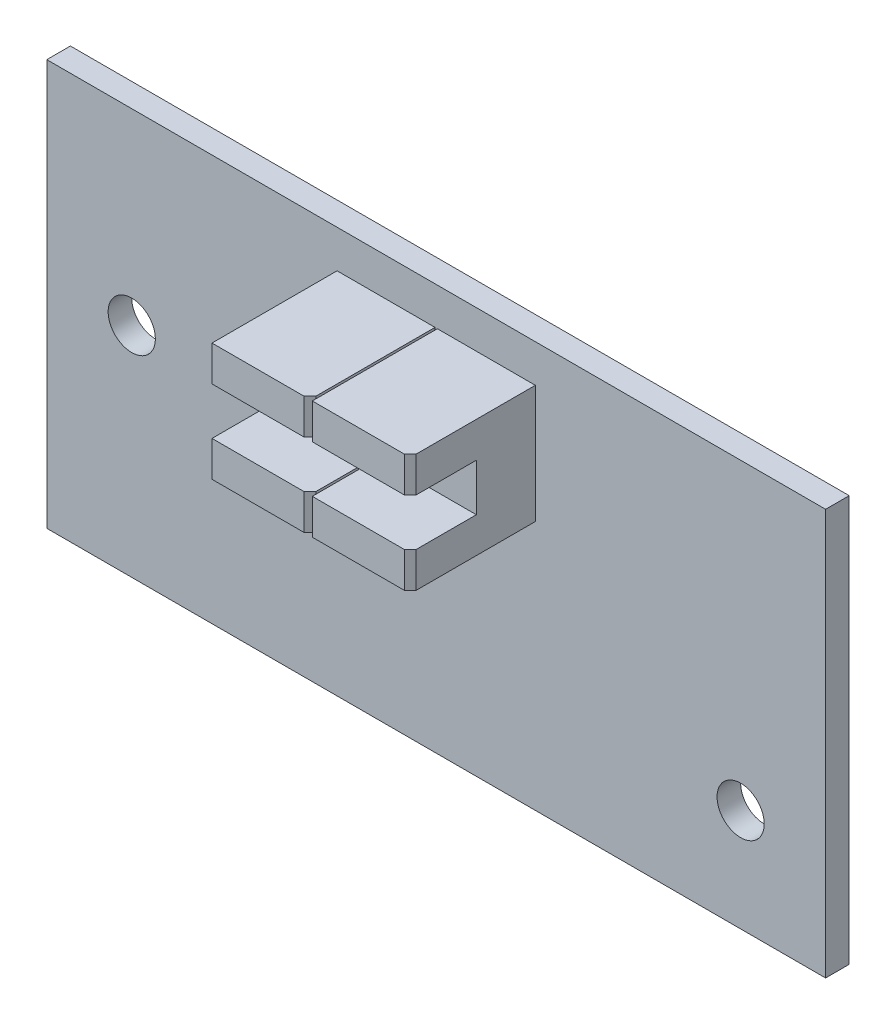
ISO-10303-21;
HEADER;
FILE_DESCRIPTION(('STEP AP214'),'2;1');
FILE_NAME('part.step','',(''),(''),'','','');
FILE_SCHEMA(('AUTOMOTIVE_DESIGN { 1 0 10303 214 1 1 1 1 }'));
ENDSEC;
DATA;
#1=APPLICATION_CONTEXT('core data for automotive mechanical design processes');
#2=APPLICATION_PROTOCOL_DEFINITION('international standard','automotive_design',2000,#1);
#3=PRODUCT_CONTEXT('',#1,'mechanical');
#4=PRODUCT('Part','Part','',(#3));
#5=PRODUCT_RELATED_PRODUCT_CATEGORY('part','',(#4));
#6=PRODUCT_DEFINITION_FORMATION('','',#4);
#7=PRODUCT_DEFINITION_CONTEXT('part definition',#1,'design');
#8=PRODUCT_DEFINITION('design','',#6,#7);
#9=PRODUCT_DEFINITION_SHAPE('','',#8);
#10=(LENGTH_UNIT() NAMED_UNIT(*) SI_UNIT(.MILLI.,.METRE.));
#11=(NAMED_UNIT(*) PLANE_ANGLE_UNIT() SI_UNIT($,.RADIAN.));
#12=(NAMED_UNIT(*) SI_UNIT($,.STERADIAN.) SOLID_ANGLE_UNIT());
#13=UNCERTAINTY_MEASURE_WITH_UNIT(LENGTH_MEASURE(1.E-05),#10,'distance_accuracy_value','');
#14=(GEOMETRIC_REPRESENTATION_CONTEXT(3) GLOBAL_UNCERTAINTY_ASSIGNED_CONTEXT((#13)) GLOBAL_UNIT_ASSIGNED_CONTEXT((#10,
#11,#12)) REPRESENTATION_CONTEXT('',''));
#15=CARTESIAN_POINT('',(0.,0.,0.));
#16=DIRECTION('',(0.,0.,1.));
#17=DIRECTION('',(1.,0.,0.));
#18=AXIS2_PLACEMENT_3D('',#15,#16,#17);
#19=CARTESIAN_POINT('',(-4.2,7.,3.5));
#20=DIRECTION('',(0.,1.,0.));
#21=DIRECTION('',(-1.,0.,0.));
#22=AXIS2_PLACEMENT_3D('',#19,#20,#21);
#23=PLANE('',#22);
#24=DIRECTION('',(1.,0.,0.));
#25=VECTOR('',#24,1.);
#26=CARTESIAN_POINT('',(0.,7.,6.3));
#27=LINE('',#26,#25);
#28=CARTESIAN_POINT('',(0.0499999999999997,7.,6.3));
#29=VERTEX_POINT('',#28);
#30=CARTESIAN_POINT('',(3.95000000000001,7.,6.3));
#31=VERTEX_POINT('',#30);
#32=EDGE_CURVE('E420',#29,#31,#27,.T.);
#33=ORIENTED_EDGE('',*,*,#32,.T.);
#34=DIRECTION('',(-0.707106781186543,0.,0.707106781186552));
#35=VECTOR('',#34,1.);
#36=CARTESIAN_POINT('',(1.27500000000005,7.,8.97499999999999));
#37=LINE('',#36,#35);
#38=CARTESIAN_POINT('',(4.2,7.,6.05));
#39=VERTEX_POINT('',#38);
#40=EDGE_CURVE('E310',#31,#39,#37,.F.);
#41=ORIENTED_EDGE('',*,*,#40,.T.);
#42=DIRECTION('',(0.,0.,-1.));
#43=VECTOR('',#42,1.);
#44=CARTESIAN_POINT('',(4.2,7.,3.5));
#45=LINE('',#44,#43);
#46=CARTESIAN_POINT('',(4.2,7.,1.));
#47=VERTEX_POINT('',#46);
#48=EDGE_CURVE('E240',#39,#47,#45,.T.);
#49=ORIENTED_EDGE('',*,*,#48,.T.);
#50=DIRECTION('',(1.,0.,0.));
#51=VECTOR('',#50,1.);
#52=CARTESIAN_POINT('',(-4.2,7.,1.));
#53=LINE('',#52,#51);
#54=CARTESIAN_POINT('',(0.0499999999999997,7.,1.));
#55=VERTEX_POINT('',#54);
#56=EDGE_CURVE('E366',#55,#47,#53,.T.);
#57=ORIENTED_EDGE('',*,*,#56,.F.);
#58=DIRECTION('',(0.,0.,1.));
#59=VECTOR('',#58,1.);
#60=CARTESIAN_POINT('',(0.0499999999999997,7.,-4.00099990001999));
#61=LINE('',#60,#59);
#62=EDGE_CURVE('E201',#55,#29,#61,.T.);
#63=ORIENTED_EDGE('',*,*,#62,.T.);
#64=EDGE_LOOP('',(#33,#41,#49,#57,#63));
#65=FACE_BOUND('',#64,.T.);
#66=ADVANCED_FACE('F36',(#65),#23,.T.);
#67=CARTESIAN_POINT('',(-4.2,2.,3.5));
#68=DIRECTION('',(0.,1.,0.));
#69=DIRECTION('',(0.,0.,1.));
#70=AXIS2_PLACEMENT_3D('',#67,#68,#69);
#71=PLANE('',#70);
#72=DIRECTION('',(0.,0.,-1.));
#73=VECTOR('',#72,1.);
#74=CARTESIAN_POINT('',(4.2,2.,3.5));
#75=LINE('',#74,#73);
#76=CARTESIAN_POINT('',(4.2,2.,6.05));
#77=VERTEX_POINT('',#76);
#78=CARTESIAN_POINT('',(4.2,2.,1.));
#79=VERTEX_POINT('',#78);
#80=EDGE_CURVE('E238',#77,#79,#75,.T.);
#81=ORIENTED_EDGE('',*,*,#80,.F.);
#82=DIRECTION('',(0.707106781186543,0.,-0.707106781186552));
#83=VECTOR('',#82,1.);
#84=CARTESIAN_POINT('',(4.2,2.,6.05));
#85=LINE('',#84,#83);
#86=CARTESIAN_POINT('',(3.95000000000001,2.,6.3));
#87=VERTEX_POINT('',#86);
#88=EDGE_CURVE('E300',#77,#87,#85,.F.);
#89=ORIENTED_EDGE('',*,*,#88,.T.);
#90=DIRECTION('',(1.,0.,0.));
#91=VECTOR('',#90,1.);
#92=CARTESIAN_POINT('',(0.,2.,6.3));
#93=LINE('',#92,#91);
#94=CARTESIAN_POINT('',(0.0500000000000006,2.,6.3));
#95=VERTEX_POINT('',#94);
#96=EDGE_CURVE('E215',#95,#87,#93,.T.);
#97=ORIENTED_EDGE('',*,*,#96,.F.);
#98=DIRECTION('',(0.,0.,1.));
#99=VECTOR('',#98,1.);
#100=CARTESIAN_POINT('',(0.0500000000000006,2.,-4.00099990001999));
#101=LINE('',#100,#99);
#102=CARTESIAN_POINT('',(0.0500000000000006,2.,1.));
#103=VERTEX_POINT('',#102);
#104=EDGE_CURVE('E198',#103,#95,#101,.T.);
#105=ORIENTED_EDGE('',*,*,#104,.F.);
#106=DIRECTION('',(1.,0.,0.));
#107=VECTOR('',#106,1.);
#108=CARTESIAN_POINT('',(-4.2,2.,1.));
#109=LINE('',#108,#107);
#110=EDGE_CURVE('E212',#103,#79,#109,.T.);
#111=ORIENTED_EDGE('',*,*,#110,.T.);
#112=EDGE_LOOP('',(#81,#89,#97,#105,#111));
#113=FACE_BOUND('',#112,.T.);
#114=ADVANCED_FACE('F211',(#113),#71,.F.);
#115=CARTESIAN_POINT('',(0.,0.,3.5));
#116=DIRECTION('',(0.,0.,-1.));
#117=DIRECTION('',(-1.,0.,0.));
#118=AXIS2_PLACEMENT_3D('',#115,#116,#117);
#119=PLANE('',#118);
#120=DIRECTION('',(-1.,0.,0.));
#121=VECTOR('',#120,1.);
#122=CARTESIAN_POINT('',(0.,5.5,3.5));
#123=LINE('',#122,#121);
#124=CARTESIAN_POINT('',(4.2,5.5,3.5));
#125=VERTEX_POINT('',#124);
#126=CARTESIAN_POINT('',(0.05,5.5,3.5));
#127=VERTEX_POINT('',#126);
#128=EDGE_CURVE('E289',#125,#127,#123,.T.);
#129=ORIENTED_EDGE('',*,*,#128,.T.);
#130=DIRECTION('',(0.,-1.,0.));
#131=VECTOR('',#130,1.);
#132=CARTESIAN_POINT('',(0.0500000000000009,0.,3.5));
#133=LINE('',#132,#131);
#134=CARTESIAN_POINT('',(0.0500000000000003,3.5,3.5));
#135=VERTEX_POINT('',#134);
#136=EDGE_CURVE('E408',#127,#135,#133,.T.);
#137=ORIENTED_EDGE('',*,*,#136,.T.);
#138=DIRECTION('',(1.,0.,0.));
#139=VECTOR('',#138,1.);
#140=CARTESIAN_POINT('',(0.,3.5,3.5));
#141=LINE('',#140,#139);
#142=CARTESIAN_POINT('',(4.2,3.5,3.5));
#143=VERTEX_POINT('',#142);
#144=EDGE_CURVE('E284',#135,#143,#141,.T.);
#145=ORIENTED_EDGE('',*,*,#144,.T.);
#146=DIRECTION('',(0.,-1.,0.));
#147=VECTOR('',#146,1.);
#148=CARTESIAN_POINT('',(4.2,7.,3.5));
#149=LINE('',#148,#147);
#150=EDGE_CURVE('E231',#125,#143,#149,.T.);
#151=ORIENTED_EDGE('',*,*,#150,.F.);
#152=EDGE_LOOP('',(#129,#137,#145,#151));
#153=FACE_BOUND('',#152,.T.);
#154=ADVANCED_FACE('F399',(#153),#119,.F.);
#155=CARTESIAN_POINT('',(0.,3.5,6.3));
#156=DIRECTION('',(0.,1.,0.));
#157=DIRECTION('',(0.,0.,1.));
#158=AXIS2_PLACEMENT_3D('',#155,#156,#157);
#159=PLANE('',#158);
#160=DIRECTION('',(1.,0.,0.));
#161=VECTOR('',#160,1.);
#162=CARTESIAN_POINT('',(0.,3.5,6.3));
#163=LINE('',#162,#161);
#164=CARTESIAN_POINT('',(0.0500000000000003,3.5,6.3));
#165=VERTEX_POINT('',#164);
#166=CARTESIAN_POINT('',(3.95000000000001,3.5,6.3));
#167=VERTEX_POINT('',#166);
#168=EDGE_CURVE('E393',#165,#167,#163,.T.);
#169=ORIENTED_EDGE('',*,*,#168,.T.);
#170=DIRECTION('',(-0.707106781186543,0.,0.707106781186552));
#171=VECTOR('',#170,1.);
#172=CARTESIAN_POINT('',(1.97500000000003,3.5,8.275));
#173=LINE('',#172,#171);
#174=CARTESIAN_POINT('',(4.2,3.5,6.05));
#175=VERTEX_POINT('',#174);
#176=EDGE_CURVE('E304',#167,#175,#173,.F.);
#177=ORIENTED_EDGE('',*,*,#176,.T.);
#178=DIRECTION('',(0.,0.,-1.));
#179=VECTOR('',#178,1.);
#180=CARTESIAN_POINT('',(4.2,3.5,6.3));
#181=LINE('',#180,#179);
#182=EDGE_CURVE('E357',#175,#143,#181,.T.);
#183=ORIENTED_EDGE('',*,*,#182,.T.);
#184=ORIENTED_EDGE('',*,*,#144,.F.);
#185=DIRECTION('',(0.,0.,-1.));
#186=VECTOR('',#185,1.);
#187=CARTESIAN_POINT('',(0.0500000000000003,3.5,6.3));
#188=LINE('',#187,#186);
#189=EDGE_CURVE('E410',#165,#135,#188,.T.);
#190=ORIENTED_EDGE('',*,*,#189,.F.);
#191=EDGE_LOOP('',(#169,#177,#183,#184,#190));
#192=FACE_BOUND('',#191,.T.);
#193=ADVANCED_FACE('F389',(#192),#159,.T.);
#194=CARTESIAN_POINT('',(0.,0.,6.3));
#195=DIRECTION('',(0.,0.,1.));
#196=DIRECTION('',(1.,0.,0.));
#197=AXIS2_PLACEMENT_3D('',#194,#195,#196);
#198=PLANE('',#197);
#199=ORIENTED_EDGE('',*,*,#96,.T.);
#200=DIRECTION('',(0.,1.,0.));
#201=VECTOR('',#200,1.);
#202=CARTESIAN_POINT('',(3.95000000000001,0.,6.3));
#203=LINE('',#202,#201);
#204=EDGE_CURVE('E302',#87,#167,#203,.T.);
#205=ORIENTED_EDGE('',*,*,#204,.T.);
#206=ORIENTED_EDGE('',*,*,#168,.F.);
#207=DIRECTION('',(0.,1.,0.));
#208=VECTOR('',#207,1.);
#209=CARTESIAN_POINT('',(0.0499999999999997,7.,6.3));
#210=LINE('',#209,#208);
#211=EDGE_CURVE('E216',#95,#165,#210,.T.);
#212=ORIENTED_EDGE('',*,*,#211,.F.);
#213=EDGE_LOOP('',(#199,#205,#206,#212));
#214=FACE_BOUND('',#213,.T.);
#215=ADVANCED_FACE('F383',(#214),#198,.T.);
#216=CARTESIAN_POINT('',(0.,5.5,6.3));
#217=DIRECTION('',(0.,-1.,0.));
#218=DIRECTION('',(1.,0.,0.));
#219=AXIS2_PLACEMENT_3D('',#216,#217,#218);
#220=PLANE('',#219);
#221=DIRECTION('',(0.,0.,-1.));
#222=VECTOR('',#221,1.);
#223=CARTESIAN_POINT('',(4.2,5.5,6.3));
#224=LINE('',#223,#222);
#225=CARTESIAN_POINT('',(4.2,5.5,6.05));
#226=VERTEX_POINT('',#225);
#227=EDGE_CURVE('E396',#226,#125,#224,.T.);
#228=ORIENTED_EDGE('',*,*,#227,.F.);
#229=DIRECTION('',(0.707106781186543,0.,-0.707106781186552));
#230=VECTOR('',#229,1.);
#231=CARTESIAN_POINT('',(1.97500000000003,5.5,8.275));
#232=LINE('',#231,#230);
#233=CARTESIAN_POINT('',(3.95000000000001,5.5,6.3));
#234=VERTEX_POINT('',#233);
#235=EDGE_CURVE('E306',#226,#234,#232,.F.);
#236=ORIENTED_EDGE('',*,*,#235,.T.);
#237=DIRECTION('',(-1.,0.,0.));
#238=VECTOR('',#237,1.);
#239=CARTESIAN_POINT('',(0.,5.5,6.3));
#240=LINE('',#239,#238);
#241=CARTESIAN_POINT('',(0.05,5.5,6.3));
#242=VERTEX_POINT('',#241);
#243=EDGE_CURVE('E406',#234,#242,#240,.T.);
#244=ORIENTED_EDGE('',*,*,#243,.T.);
#245=DIRECTION('',(0.,0.,1.));
#246=VECTOR('',#245,1.);
#247=CARTESIAN_POINT('',(0.05,5.5,6.3));
#248=LINE('',#247,#246);
#249=EDGE_CURVE('E343',#127,#242,#248,.T.);
#250=ORIENTED_EDGE('',*,*,#249,.F.);
#251=ORIENTED_EDGE('',*,*,#128,.F.);
#252=EDGE_LOOP('',(#228,#236,#244,#250,#251));
#253=FACE_BOUND('',#252,.T.);
#254=ADVANCED_FACE('F403',(#253),#220,.T.);
#255=CARTESIAN_POINT('',(0.,0.,6.3));
#256=DIRECTION('',(0.,0.,1.));
#257=DIRECTION('',(1.,0.,0.));
#258=AXIS2_PLACEMENT_3D('',#255,#256,#257);
#259=PLANE('',#258);
#260=ORIENTED_EDGE('',*,*,#243,.F.);
#261=DIRECTION('',(0.,1.,0.));
#262=VECTOR('',#261,1.);
#263=CARTESIAN_POINT('',(3.95000000000001,0.,6.3));
#264=LINE('',#263,#262);
#265=EDGE_CURVE('E308',#234,#31,#264,.T.);
#266=ORIENTED_EDGE('',*,*,#265,.T.);
#267=ORIENTED_EDGE('',*,*,#32,.F.);
#268=DIRECTION('',(0.,1.,0.));
#269=VECTOR('',#268,1.);
#270=CARTESIAN_POINT('',(0.0500000000000009,0.,6.3));
#271=LINE('',#270,#269);
#272=EDGE_CURVE('E292',#242,#29,#271,.T.);
#273=ORIENTED_EDGE('',*,*,#272,.F.);
#274=EDGE_LOOP('',(#260,#266,#267,#273));
#275=FACE_BOUND('',#274,.T.);
#276=ADVANCED_FACE('F455',(#275),#259,.T.);
#277=CARTESIAN_POINT('',(0.,0.,1.));
#278=DIRECTION('',(0.,0.,-1.));
#279=DIRECTION('',(-1.,0.,0.));
#280=AXIS2_PLACEMENT_3D('',#277,#278,#279);
#281=PLANE('',#280);
#282=CARTESIAN_POINT('',(-4.2,7.,1.));
#283=VERTEX_POINT('',#282);
#284=CARTESIAN_POINT('',(-0.0499999999999997,7.,1.));
#285=VERTEX_POINT('',#284);
#286=EDGE_CURVE('E226',#283,#285,#53,.T.);
#287=ORIENTED_EDGE('',*,*,#286,.T.);
#288=DIRECTION('',(0.,-1.,0.));
#289=VECTOR('',#288,1.);
#290=CARTESIAN_POINT('',(-0.0499999999999997,7.,1.));
#291=LINE('',#290,#289);
#292=CARTESIAN_POINT('',(-0.0500000000000006,2.,1.));
#293=VERTEX_POINT('',#292);
#294=EDGE_CURVE('E436',#285,#293,#291,.T.);
#295=ORIENTED_EDGE('',*,*,#294,.T.);
#296=CARTESIAN_POINT('',(-4.2,2.,1.));
#297=VERTEX_POINT('',#296);
#298=EDGE_CURVE('E222',#297,#293,#109,.T.);
#299=ORIENTED_EDGE('',*,*,#298,.F.);
#300=DIRECTION('',(0.,-1.,0.));
#301=VECTOR('',#300,1.);
#302=CARTESIAN_POINT('',(-4.2,7.,1.));
#303=LINE('',#302,#301);
#304=EDGE_CURVE('E225',#283,#297,#303,.T.);
#305=ORIENTED_EDGE('',*,*,#304,.F.);
#306=EDGE_LOOP('',(#287,#295,#299,#305));
#307=FACE_BOUND('',#306,.T.);
#308=DIRECTION('',(0.,1.,0.));
#309=VECTOR('',#308,1.);
#310=CARTESIAN_POINT('',(0.0499999999999997,7.,1.));
#311=LINE('',#310,#309);
#312=EDGE_CURVE('E195',#103,#55,#311,.T.);
#313=ORIENTED_EDGE('',*,*,#312,.T.);
#314=ORIENTED_EDGE('',*,*,#56,.T.);
#315=DIRECTION('',(0.,-1.,0.));
#316=VECTOR('',#315,1.);
#317=CARTESIAN_POINT('',(4.2,7.,1.));
#318=LINE('',#317,#316);
#319=EDGE_CURVE('E221',#47,#79,#318,.T.);
#320=ORIENTED_EDGE('',*,*,#319,.T.);
#321=ORIENTED_EDGE('',*,*,#110,.F.);
#322=EDGE_LOOP('',(#313,#314,#320,#321));
#323=FACE_BOUND('',#322,.T.);
#324=DIRECTION('',(0.,1.,0.));
#325=VECTOR('',#324,1.);
#326=CARTESIAN_POINT('',(16.5,-8.6,1.));
#327=LINE('',#326,#325);
#328=CARTESIAN_POINT('',(16.5,-8.6,1.));
#329=VERTEX_POINT('',#328);
#330=CARTESIAN_POINT('',(16.5,8.6,1.));
#331=VERTEX_POINT('',#330);
#332=EDGE_CURVE('E255',#329,#331,#327,.T.);
#333=ORIENTED_EDGE('',*,*,#332,.T.);
#334=DIRECTION('',(-1.,0.,0.));
#335=VECTOR('',#334,1.);
#336=CARTESIAN_POINT('',(-16.5,8.6,1.));
#337=LINE('',#336,#335);
#338=CARTESIAN_POINT('',(-16.5,8.6,1.));
#339=VERTEX_POINT('',#338);
#340=EDGE_CURVE('E258',#331,#339,#337,.T.);
#341=ORIENTED_EDGE('',*,*,#340,.T.);
#342=DIRECTION('',(0.,-1.,0.));
#343=VECTOR('',#342,1.);
#344=CARTESIAN_POINT('',(-16.5,-8.6,1.));
#345=LINE('',#344,#343);
#346=CARTESIAN_POINT('',(-16.5,-8.6,1.));
#347=VERTEX_POINT('',#346);
#348=EDGE_CURVE('E261',#339,#347,#345,.T.);
#349=ORIENTED_EDGE('',*,*,#348,.T.);
#350=DIRECTION('',(1.,0.,0.));
#351=VECTOR('',#350,1.);
#352=CARTESIAN_POINT('',(-16.5,-8.6,1.));
#353=LINE('',#352,#351);
#354=EDGE_CURVE('E263',#347,#329,#353,.T.);
#355=ORIENTED_EDGE('',*,*,#354,.T.);
#356=EDGE_LOOP('',(#333,#341,#349,#355));
#357=FACE_BOUND('',#356,.T.);
#358=CARTESIAN_POINT('',(-12.9,0.649999999999996,1.));
#359=DIRECTION('',(0.,0.,1.));
#360=DIRECTION('',(1.,0.,0.));
#361=AXIS2_PLACEMENT_3D('',#358,#359,#360);
#362=CIRCLE('',#361,1.);
#363=CARTESIAN_POINT('',(-11.9,0.649999999999996,1.));
#364=VERTEX_POINT('',#363);
#365=EDGE_CURVE('E249',#364,#364,#362,.T.);
#366=ORIENTED_EDGE('',*,*,#365,.F.);
#367=EDGE_LOOP('',(#366));
#368=FACE_BOUND('',#367,.T.);
#369=CARTESIAN_POINT('',(12.9,-4.25,1.));
#370=DIRECTION('',(0.,0.,1.));
#371=DIRECTION('',(1.,0.,0.));
#372=AXIS2_PLACEMENT_3D('',#369,#370,#371);
#373=CIRCLE('',#372,1.);
#374=CARTESIAN_POINT('',(13.9,-4.25,1.));
#375=VERTEX_POINT('',#374);
#376=EDGE_CURVE('E243',#375,#375,#373,.T.);
#377=ORIENTED_EDGE('',*,*,#376,.F.);
#378=EDGE_LOOP('',(#377));
#379=FACE_BOUND('',#378,.T.);
#380=ADVANCED_FACE('F218',(#307,#323,#357,#368,#379),#281,.F.);
#381=CARTESIAN_POINT('',(0.,0.,0.));
#382=DIRECTION('',(0.,0.,-1.));
#383=DIRECTION('',(-1.,0.,0.));
#384=AXIS2_PLACEMENT_3D('',#381,#382,#383);
#385=PLANE('',#384);
#386=CARTESIAN_POINT('',(-12.9,0.649999999999996,0.));
#387=DIRECTION('',(0.,0.,1.));
#388=DIRECTION('',(1.,0.,0.));
#389=AXIS2_PLACEMENT_3D('',#386,#387,#388);
#390=CIRCLE('',#389,1.);
#391=CARTESIAN_POINT('',(-11.9,0.649999999999996,0.));
#392=VERTEX_POINT('',#391);
#393=EDGE_CURVE('E246',#392,#392,#390,.T.);
#394=ORIENTED_EDGE('',*,*,#393,.T.);
#395=EDGE_LOOP('',(#394));
#396=FACE_BOUND('',#395,.T.);
#397=DIRECTION('',(0.,1.,0.));
#398=VECTOR('',#397,1.);
#399=CARTESIAN_POINT('',(16.5,-8.6,0.));
#400=LINE('',#399,#398);
#401=CARTESIAN_POINT('',(16.5,-8.6,0.));
#402=VERTEX_POINT('',#401);
#403=CARTESIAN_POINT('',(16.5,8.6,0.));
#404=VERTEX_POINT('',#403);
#405=EDGE_CURVE('E252',#402,#404,#400,.T.);
#406=ORIENTED_EDGE('',*,*,#405,.F.);
#407=DIRECTION('',(1.,0.,0.));
#408=VECTOR('',#407,1.);
#409=CARTESIAN_POINT('',(-16.5,-8.6,0.));
#410=LINE('',#409,#408);
#411=CARTESIAN_POINT('',(-16.5,-8.6,0.));
#412=VERTEX_POINT('',#411);
#413=EDGE_CURVE('E259',#412,#402,#410,.T.);
#414=ORIENTED_EDGE('',*,*,#413,.F.);
#415=DIRECTION('',(0.,-1.,0.));
#416=VECTOR('',#415,1.);
#417=CARTESIAN_POINT('',(-16.5,-8.6,0.));
#418=LINE('',#417,#416);
#419=CARTESIAN_POINT('',(-16.5,8.6,0.));
#420=VERTEX_POINT('',#419);
#421=EDGE_CURVE('E270',#420,#412,#418,.T.);
#422=ORIENTED_EDGE('',*,*,#421,.F.);
#423=DIRECTION('',(-1.,0.,0.));
#424=VECTOR('',#423,1.);
#425=CARTESIAN_POINT('',(-16.5,8.6,0.));
#426=LINE('',#425,#424);
#427=EDGE_CURVE('E268',#404,#420,#426,.T.);
#428=ORIENTED_EDGE('',*,*,#427,.F.);
#429=EDGE_LOOP('',(#406,#414,#422,#428));
#430=FACE_BOUND('',#429,.T.);
#431=CARTESIAN_POINT('',(12.9,-4.25,0.));
#432=DIRECTION('',(0.,0.,1.));
#433=DIRECTION('',(1.,0.,0.));
#434=AXIS2_PLACEMENT_3D('',#431,#432,#433);
#435=CIRCLE('',#434,1.);
#436=CARTESIAN_POINT('',(13.9,-4.25,0.));
#437=VERTEX_POINT('',#436);
#438=EDGE_CURVE('E234',#437,#437,#435,.T.);
#439=ORIENTED_EDGE('',*,*,#438,.T.);
#440=EDGE_LOOP('',(#439));
#441=FACE_BOUND('',#440,.T.);
#442=ADVANCED_FACE('F492',(#396,#430,#441),#385,.T.);
#443=CARTESIAN_POINT('',(16.5,-8.6,1.));
#444=DIRECTION('',(-1.,0.,0.));
#445=DIRECTION('',(0.,0.,1.));
#446=AXIS2_PLACEMENT_3D('',#443,#444,#445);
#447=PLANE('',#446);
#448=ORIENTED_EDGE('',*,*,#405,.T.);
#449=DIRECTION('',(0.,0.,-1.));
#450=VECTOR('',#449,1.);
#451=CARTESIAN_POINT('',(16.5,8.6,1.));
#452=LINE('',#451,#450);
#453=EDGE_CURVE('E281',#331,#404,#452,.T.);
#454=ORIENTED_EDGE('',*,*,#453,.F.);
#455=ORIENTED_EDGE('',*,*,#332,.F.);
#456=DIRECTION('',(0.,0.,-1.));
#457=VECTOR('',#456,1.);
#458=CARTESIAN_POINT('',(16.5,-8.6,1.));
#459=LINE('',#458,#457);
#460=EDGE_CURVE('E265',#329,#402,#459,.T.);
#461=ORIENTED_EDGE('',*,*,#460,.T.);
#462=EDGE_LOOP('',(#448,#454,#455,#461));
#463=FACE_BOUND('',#462,.T.);
#464=ADVANCED_FACE('F495',(#463),#447,.F.);
#465=CARTESIAN_POINT('',(-16.5,8.6,1.));
#466=DIRECTION('',(0.,-1.,0.));
#467=DIRECTION('',(0.,0.,-1.));
#468=AXIS2_PLACEMENT_3D('',#465,#466,#467);
#469=PLANE('',#468);
#470=ORIENTED_EDGE('',*,*,#427,.T.);
#471=DIRECTION('',(0.,0.,-1.));
#472=VECTOR('',#471,1.);
#473=CARTESIAN_POINT('',(-16.5,8.6,1.));
#474=LINE('',#473,#472);
#475=EDGE_CURVE('E278',#339,#420,#474,.T.);
#476=ORIENTED_EDGE('',*,*,#475,.F.);
#477=ORIENTED_EDGE('',*,*,#340,.F.);
#478=ORIENTED_EDGE('',*,*,#453,.T.);
#479=EDGE_LOOP('',(#470,#476,#477,#478));
#480=FACE_BOUND('',#479,.T.);
#481=ADVANCED_FACE('F503',(#480),#469,.F.);
#482=CARTESIAN_POINT('',(-16.5,-8.6,1.));
#483=DIRECTION('',(1.,0.,0.));
#484=DIRECTION('',(0.,0.,-1.));
#485=AXIS2_PLACEMENT_3D('',#482,#483,#484);
#486=PLANE('',#485);
#487=ORIENTED_EDGE('',*,*,#421,.T.);
#488=DIRECTION('',(0.,0.,-1.));
#489=VECTOR('',#488,1.);
#490=CARTESIAN_POINT('',(-16.5,-8.6,1.));
#491=LINE('',#490,#489);
#492=EDGE_CURVE('E275',#347,#412,#491,.T.);
#493=ORIENTED_EDGE('',*,*,#492,.F.);
#494=ORIENTED_EDGE('',*,*,#348,.F.);
#495=ORIENTED_EDGE('',*,*,#475,.T.);
#496=EDGE_LOOP('',(#487,#493,#494,#495));
#497=FACE_BOUND('',#496,.T.);
#498=ADVANCED_FACE('F499',(#497),#486,.F.);
#499=CARTESIAN_POINT('',(-16.5,-8.6,1.));
#500=DIRECTION('',(0.,1.,0.));
#501=DIRECTION('',(0.,0.,1.));
#502=AXIS2_PLACEMENT_3D('',#499,#500,#501);
#503=PLANE('',#502);
#504=ORIENTED_EDGE('',*,*,#413,.T.);
#505=ORIENTED_EDGE('',*,*,#460,.F.);
#506=ORIENTED_EDGE('',*,*,#354,.F.);
#507=ORIENTED_EDGE('',*,*,#492,.T.);
#508=EDGE_LOOP('',(#504,#505,#506,#507));
#509=FACE_BOUND('',#508,.T.);
#510=ADVANCED_FACE('F485',(#509),#503,.F.);
#511=CARTESIAN_POINT('',(-12.9,0.649999999999996,1.));
#512=DIRECTION('',(0.,0.,-1.));
#513=DIRECTION('',(-1.,0.,0.));
#514=AXIS2_PLACEMENT_3D('',#511,#512,#513);
#515=CYLINDRICAL_SURFACE('',#514,1.);
#516=ORIENTED_EDGE('',*,*,#365,.T.);
#517=EDGE_LOOP('',(#516));
#518=FACE_BOUND('',#517,.T.);
#519=ORIENTED_EDGE('',*,*,#393,.F.);
#520=EDGE_LOOP('',(#519));
#521=FACE_BOUND('',#520,.T.);
#522=ADVANCED_FACE('F480',(#518,#521),#515,.F.);
#523=CARTESIAN_POINT('',(12.9,-4.25,1.));
#524=DIRECTION('',(0.,0.,-1.));
#525=DIRECTION('',(-1.,0.,0.));
#526=AXIS2_PLACEMENT_3D('',#523,#524,#525);
#527=CYLINDRICAL_SURFACE('',#526,1.);
#528=ORIENTED_EDGE('',*,*,#376,.T.);
#529=EDGE_LOOP('',(#528));
#530=FACE_BOUND('',#529,.T.);
#531=ORIENTED_EDGE('',*,*,#438,.F.);
#532=EDGE_LOOP('',(#531));
#533=FACE_BOUND('',#532,.T.);
#534=ADVANCED_FACE('F474',(#530,#533),#527,.F.);
#535=CARTESIAN_POINT('',(-4.2,7.,6.3));
#536=VERTEX_POINT('',#535);
#537=CARTESIAN_POINT('',(-0.299999999999996,7.,6.3));
#538=VERTEX_POINT('',#537);
#539=EDGE_CURVE('E417',#536,#538,#27,.T.);
#540=ORIENTED_EDGE('',*,*,#539,.T.);
#541=DIRECTION('',(0.707106781186543,0.,-0.707106781186552));
#542=VECTOR('',#541,1.);
#543=CARTESIAN_POINT('',(-0.849999999999971,7.,6.84999999999998));
#544=LINE('',#543,#542);
#545=CARTESIAN_POINT('',(-0.0499999999999997,7.,6.05));
#546=VERTEX_POINT('',#545);
#547=EDGE_CURVE('E11',#538,#546,#544,.T.);
#548=ORIENTED_EDGE('',*,*,#547,.T.);
#549=DIRECTION('',(0.,0.,1.));
#550=VECTOR('',#549,1.);
#551=CARTESIAN_POINT('',(-0.0499999999999997,7.,-4.00099990001999));
#552=LINE('',#551,#550);
#553=EDGE_CURVE('E439',#285,#546,#552,.T.);
#554=ORIENTED_EDGE('',*,*,#553,.F.);
#555=ORIENTED_EDGE('',*,*,#286,.F.);
#556=DIRECTION('',(0.,0.,-1.));
#557=VECTOR('',#556,1.);
#558=CARTESIAN_POINT('',(-4.2,7.,3.5));
#559=LINE('',#558,#557);
#560=EDGE_CURVE('E232',#536,#283,#559,.T.);
#561=ORIENTED_EDGE('',*,*,#560,.F.);
#562=EDGE_LOOP('',(#540,#548,#554,#555,#561));
#563=FACE_BOUND('',#562,.T.);
#564=ADVANCED_FACE('F451',(#563),#23,.T.);
#565=CARTESIAN_POINT('',(-4.2,7.,3.5));
#566=DIRECTION('',(1.,0.,0.));
#567=DIRECTION('',(0.,0.,-1.));
#568=AXIS2_PLACEMENT_3D('',#565,#566,#567);
#569=PLANE('',#568);
#570=DIRECTION('',(0.,-1.,0.));
#571=VECTOR('',#570,1.);
#572=CARTESIAN_POINT('',(-4.2,7.,3.5));
#573=LINE('',#572,#571);
#574=CARTESIAN_POINT('',(-4.2,5.5,3.5));
#575=VERTEX_POINT('',#574);
#576=CARTESIAN_POINT('',(-4.2,3.5,3.5));
#577=VERTEX_POINT('',#576);
#578=EDGE_CURVE('E242',#575,#577,#573,.T.);
#579=ORIENTED_EDGE('',*,*,#578,.F.);
#580=DIRECTION('',(0.,0.,-1.));
#581=VECTOR('',#580,1.);
#582=CARTESIAN_POINT('',(-4.2,5.5,6.3));
#583=LINE('',#582,#581);
#584=CARTESIAN_POINT('',(-4.2,5.5,6.3));
#585=VERTEX_POINT('',#584);
#586=EDGE_CURVE('E423',#585,#575,#583,.T.);
#587=ORIENTED_EDGE('',*,*,#586,.F.);
#588=DIRECTION('',(0.,-1.,0.));
#589=VECTOR('',#588,1.);
#590=CARTESIAN_POINT('',(-4.2,0.,6.3));
#591=LINE('',#590,#589);
#592=EDGE_CURVE('E419',#536,#585,#591,.T.);
#593=ORIENTED_EDGE('',*,*,#592,.F.);
#594=ORIENTED_EDGE('',*,*,#560,.T.);
#595=ORIENTED_EDGE('',*,*,#304,.T.);
#596=DIRECTION('',(0.,0.,-1.));
#597=VECTOR('',#596,1.);
#598=CARTESIAN_POINT('',(-4.2,2.,3.5));
#599=LINE('',#598,#597);
#600=CARTESIAN_POINT('',(-4.2,2.,6.3));
#601=VERTEX_POINT('',#600);
#602=EDGE_CURVE('E235',#601,#297,#599,.T.);
#603=ORIENTED_EDGE('',*,*,#602,.F.);
#604=DIRECTION('',(0.,-1.,0.));
#605=VECTOR('',#604,1.);
#606=CARTESIAN_POINT('',(-4.2,0.,6.3));
#607=LINE('',#606,#605);
#608=CARTESIAN_POINT('',(-4.2,3.5,6.3));
#609=VERTEX_POINT('',#608);
#610=EDGE_CURVE('E356',#609,#601,#607,.T.);
#611=ORIENTED_EDGE('',*,*,#610,.F.);
#612=DIRECTION('',(0.,0.,-1.));
#613=VECTOR('',#612,1.);
#614=CARTESIAN_POINT('',(-4.2,3.5,6.3));
#615=LINE('',#614,#613);
#616=EDGE_CURVE('E359',#609,#577,#615,.T.);
#617=ORIENTED_EDGE('',*,*,#616,.T.);
#618=EDGE_LOOP('',(#579,#587,#593,#594,#595,#603,#611,#617));
#619=FACE_BOUND('',#618,.T.);
#620=ADVANCED_FACE('F432',(#619),#569,.F.);
#621=DIRECTION('',(0.,0.,1.));
#622=VECTOR('',#621,1.);
#623=CARTESIAN_POINT('',(-0.0500000000000006,2.,-4.00099990001999));
#624=LINE('',#623,#622);
#625=CARTESIAN_POINT('',(-0.0500000000000006,2.,6.05));
#626=VERTEX_POINT('',#625);
#627=EDGE_CURVE('E351',#293,#626,#624,.T.);
#628=ORIENTED_EDGE('',*,*,#627,.T.);
#629=DIRECTION('',(-0.707106781186548,0.,0.707106781186548));
#630=VECTOR('',#629,1.);
#631=CARTESIAN_POINT('',(-0.0500000000000001,2.,6.05));
#632=LINE('',#631,#630);
#633=CARTESIAN_POINT('',(-0.300000000000004,2.,6.3));
#634=VERTEX_POINT('',#633);
#635=EDGE_CURVE('E318',#626,#634,#632,.T.);
#636=ORIENTED_EDGE('',*,*,#635,.T.);
#637=EDGE_CURVE('E350',#601,#634,#93,.T.);
#638=ORIENTED_EDGE('',*,*,#637,.F.);
#639=ORIENTED_EDGE('',*,*,#602,.T.);
#640=ORIENTED_EDGE('',*,*,#298,.T.);
#641=EDGE_LOOP('',(#628,#636,#638,#639,#640));
#642=FACE_BOUND('',#641,.T.);
#643=ADVANCED_FACE('F349',(#642),#71,.F.);
#644=CARTESIAN_POINT('',(4.2,7.,3.5));
#645=DIRECTION('',(1.,0.,0.));
#646=DIRECTION('',(0.,1.,0.));
#647=AXIS2_PLACEMENT_3D('',#644,#645,#646);
#648=PLANE('',#647);
#649=ORIENTED_EDGE('',*,*,#182,.F.);
#650=DIRECTION('',(0.,-1.,0.));
#651=VECTOR('',#650,1.);
#652=CARTESIAN_POINT('',(4.2,7.,6.05));
#653=LINE('',#652,#651);
#654=EDGE_CURVE('E297',#175,#77,#653,.T.);
#655=ORIENTED_EDGE('',*,*,#654,.T.);
#656=ORIENTED_EDGE('',*,*,#80,.T.);
#657=ORIENTED_EDGE('',*,*,#319,.F.);
#658=ORIENTED_EDGE('',*,*,#48,.F.);
#659=DIRECTION('',(0.,-1.,0.));
#660=VECTOR('',#659,1.);
#661=CARTESIAN_POINT('',(4.2,7.,6.05));
#662=LINE('',#661,#660);
#663=EDGE_CURVE('E294',#39,#226,#662,.T.);
#664=ORIENTED_EDGE('',*,*,#663,.T.);
#665=ORIENTED_EDGE('',*,*,#227,.T.);
#666=ORIENTED_EDGE('',*,*,#150,.T.);
#667=EDGE_LOOP('',(#649,#655,#656,#657,#658,#664,#665,#666));
#668=FACE_BOUND('',#667,.T.);
#669=ADVANCED_FACE('F377',(#668),#648,.T.);
#670=CARTESIAN_POINT('',(-0.0500000000000003,3.5,3.5));
#671=VERTEX_POINT('',#670);
#672=EDGE_CURVE('E285',#577,#671,#141,.T.);
#673=ORIENTED_EDGE('',*,*,#672,.T.);
#674=DIRECTION('',(0.,1.,0.));
#675=VECTOR('',#674,1.);
#676=CARTESIAN_POINT('',(-0.0500000000000009,0.,3.5));
#677=LINE('',#676,#675);
#678=CARTESIAN_POINT('',(-0.05,5.5,3.5));
#679=VERTEX_POINT('',#678);
#680=EDGE_CURVE('E342',#671,#679,#677,.T.);
#681=ORIENTED_EDGE('',*,*,#680,.T.);
#682=EDGE_CURVE('E288',#679,#575,#123,.T.);
#683=ORIENTED_EDGE('',*,*,#682,.T.);
#684=ORIENTED_EDGE('',*,*,#578,.T.);
#685=EDGE_LOOP('',(#673,#681,#683,#684));
#686=FACE_BOUND('',#685,.T.);
#687=ADVANCED_FACE('F434',(#686),#119,.F.);
#688=CARTESIAN_POINT('',(-0.300000000000004,3.5,6.3));
#689=VERTEX_POINT('',#688);
#690=EDGE_CURVE('E333',#609,#689,#163,.T.);
#691=ORIENTED_EDGE('',*,*,#690,.T.);
#692=DIRECTION('',(0.707106781186548,0.,-0.707106781186548));
#693=VECTOR('',#692,1.);
#694=CARTESIAN_POINT('',(-0.150000000000002,3.5,6.15));
#695=LINE('',#694,#693);
#696=CARTESIAN_POINT('',(-0.0500000000000003,3.5,6.05));
#697=VERTEX_POINT('',#696);
#698=EDGE_CURVE('E322',#689,#697,#695,.T.);
#699=ORIENTED_EDGE('',*,*,#698,.T.);
#700=DIRECTION('',(0.,0.,1.));
#701=VECTOR('',#700,1.);
#702=CARTESIAN_POINT('',(-0.0500000000000003,3.5,6.3));
#703=LINE('',#702,#701);
#704=EDGE_CURVE('E331',#671,#697,#703,.T.);
#705=ORIENTED_EDGE('',*,*,#704,.F.);
#706=ORIENTED_EDGE('',*,*,#672,.F.);
#707=ORIENTED_EDGE('',*,*,#616,.F.);
#708=EDGE_LOOP('',(#691,#699,#705,#706,#707));
#709=FACE_BOUND('',#708,.T.);
#710=ADVANCED_FACE('F329',(#709),#159,.T.);
#711=ORIENTED_EDGE('',*,*,#637,.T.);
#712=DIRECTION('',(0.,1.,0.));
#713=VECTOR('',#712,1.);
#714=CARTESIAN_POINT('',(-0.300000000000004,3.5,6.3));
#715=LINE('',#714,#713);
#716=EDGE_CURVE('E320',#634,#689,#715,.T.);
#717=ORIENTED_EDGE('',*,*,#716,.T.);
#718=ORIENTED_EDGE('',*,*,#690,.F.);
#719=ORIENTED_EDGE('',*,*,#610,.T.);
#720=EDGE_LOOP('',(#711,#717,#718,#719));
#721=FACE_BOUND('',#720,.T.);
#722=ADVANCED_FACE('F354',(#721),#198,.T.);
#723=DIRECTION('',(0.,0.,-1.));
#724=VECTOR('',#723,1.);
#725=CARTESIAN_POINT('',(-0.05,5.5,6.3));
#726=LINE('',#725,#724);
#727=CARTESIAN_POINT('',(-0.05,5.5,6.05));
#728=VERTEX_POINT('',#727);
#729=EDGE_CURVE('E441',#728,#679,#726,.T.);
#730=ORIENTED_EDGE('',*,*,#729,.F.);
#731=DIRECTION('',(-0.707106781186543,0.,0.707106781186552));
#732=VECTOR('',#731,1.);
#733=CARTESIAN_POINT('',(-0.150000000000001,5.5,6.15));
#734=LINE('',#733,#732);
#735=CARTESIAN_POINT('',(-0.299999999999997,5.5,6.3));
#736=VERTEX_POINT('',#735);
#737=EDGE_CURVE('E58',#728,#736,#734,.T.);
#738=ORIENTED_EDGE('',*,*,#737,.T.);
#739=EDGE_CURVE('E415',#736,#585,#240,.T.);
#740=ORIENTED_EDGE('',*,*,#739,.T.);
#741=ORIENTED_EDGE('',*,*,#586,.T.);
#742=ORIENTED_EDGE('',*,*,#682,.F.);
#743=EDGE_LOOP('',(#730,#738,#740,#741,#742));
#744=FACE_BOUND('',#743,.T.);
#745=ADVANCED_FACE('F428',(#744),#220,.T.);
#746=ORIENTED_EDGE('',*,*,#739,.F.);
#747=DIRECTION('',(0.,1.,0.));
#748=VECTOR('',#747,1.);
#749=CARTESIAN_POINT('',(-0.299999999999996,7.,6.3));
#750=LINE('',#749,#748);
#751=EDGE_CURVE('E44',#736,#538,#750,.T.);
#752=ORIENTED_EDGE('',*,*,#751,.T.);
#753=ORIENTED_EDGE('',*,*,#539,.F.);
#754=ORIENTED_EDGE('',*,*,#592,.T.);
#755=EDGE_LOOP('',(#746,#752,#753,#754));
#756=FACE_BOUND('',#755,.T.);
#757=ADVANCED_FACE('F452',(#756),#259,.T.);
#758=CARTESIAN_POINT('',(0.0499999999999997,7.,-4.00099990001999));
#759=DIRECTION('',(1.,0.,0.));
#760=DIRECTION('',(0.,1.,0.));
#761=AXIS2_PLACEMENT_3D('',#758,#759,#760);
#762=PLANE('',#761);
#763=ORIENTED_EDGE('',*,*,#189,.T.);
#764=ORIENTED_EDGE('',*,*,#136,.F.);
#765=ORIENTED_EDGE('',*,*,#249,.T.);
#766=ORIENTED_EDGE('',*,*,#272,.T.);
#767=ORIENTED_EDGE('',*,*,#62,.F.);
#768=ORIENTED_EDGE('',*,*,#312,.F.);
#769=ORIENTED_EDGE('',*,*,#104,.T.);
#770=ORIENTED_EDGE('',*,*,#211,.T.);
#771=EDGE_LOOP('',(#763,#764,#765,#766,#767,#768,#769,#770));
#772=FACE_BOUND('',#771,.T.);
#773=ADVANCED_FACE('F197',(#772),#762,.F.);
#774=CARTESIAN_POINT('',(-0.0499999999999997,7.,-4.00099990001999));
#775=DIRECTION('',(-1.,0.,0.));
#776=DIRECTION('',(0.,-1.,0.));
#777=AXIS2_PLACEMENT_3D('',#774,#775,#776);
#778=PLANE('',#777);
#779=ORIENTED_EDGE('',*,*,#704,.T.);
#780=DIRECTION('',(0.,-1.,0.));
#781=VECTOR('',#780,1.);
#782=CARTESIAN_POINT('',(-0.0500000000000006,2.,6.05));
#783=LINE('',#782,#781);
#784=EDGE_CURVE('E315',#697,#626,#783,.T.);
#785=ORIENTED_EDGE('',*,*,#784,.T.);
#786=ORIENTED_EDGE('',*,*,#627,.F.);
#787=ORIENTED_EDGE('',*,*,#294,.F.);
#788=ORIENTED_EDGE('',*,*,#553,.T.);
#789=DIRECTION('',(0.,-1.,0.));
#790=VECTOR('',#789,1.);
#791=CARTESIAN_POINT('',(-0.05,5.5,6.05));
#792=LINE('',#791,#790);
#793=EDGE_CURVE('E312',#546,#728,#792,.T.);
#794=ORIENTED_EDGE('',*,*,#793,.T.);
#795=ORIENTED_EDGE('',*,*,#729,.T.);
#796=ORIENTED_EDGE('',*,*,#680,.F.);
#797=EDGE_LOOP('',(#779,#785,#786,#787,#788,#794,#795,#796));
#798=FACE_BOUND('',#797,.T.);
#799=ADVANCED_FACE('F338',(#798),#778,.F.);
#800=CARTESIAN_POINT('',(4.2,7.,6.05));
#801=DIRECTION('',(-0.707106781186552,0.,-0.707106781186543));
#802=DIRECTION('',(0.,-1.,0.));
#803=AXIS2_PLACEMENT_3D('',#800,#801,#802);
#804=PLANE('',#803);
#805=ORIENTED_EDGE('',*,*,#176,.F.);
#806=ORIENTED_EDGE('',*,*,#204,.F.);
#807=ORIENTED_EDGE('',*,*,#88,.F.);
#808=ORIENTED_EDGE('',*,*,#654,.F.);
#809=EDGE_LOOP('',(#805,#806,#807,#808));
#810=FACE_BOUND('',#809,.T.);
#811=ADVANCED_FACE('F387',(#810),#804,.F.);
#812=CARTESIAN_POINT('',(4.2,7.,6.05));
#813=DIRECTION('',(-0.707106781186552,0.,-0.707106781186543));
#814=DIRECTION('',(0.,-1.,0.));
#815=AXIS2_PLACEMENT_3D('',#812,#813,#814);
#816=PLANE('',#815);
#817=ORIENTED_EDGE('',*,*,#40,.F.);
#818=ORIENTED_EDGE('',*,*,#265,.F.);
#819=ORIENTED_EDGE('',*,*,#235,.F.);
#820=ORIENTED_EDGE('',*,*,#663,.F.);
#821=EDGE_LOOP('',(#817,#818,#819,#820));
#822=FACE_BOUND('',#821,.T.);
#823=ADVANCED_FACE('F513',(#822),#816,.F.);
#824=CARTESIAN_POINT('',(-0.0499999999999997,7.,6.05));
#825=DIRECTION('',(0.707106781186547,0.,0.707106781186547));
#826=DIRECTION('',(0.,1.,0.));
#827=AXIS2_PLACEMENT_3D('',#824,#825,#826);
#828=PLANE('',#827);
#829=ORIENTED_EDGE('',*,*,#698,.F.);
#830=ORIENTED_EDGE('',*,*,#716,.F.);
#831=ORIENTED_EDGE('',*,*,#635,.F.);
#832=ORIENTED_EDGE('',*,*,#784,.F.);
#833=EDGE_LOOP('',(#829,#830,#831,#832));
#834=FACE_BOUND('',#833,.T.);
#835=ADVANCED_FACE('F345',(#834),#828,.T.);
#836=CARTESIAN_POINT('',(-0.0499999999999997,7.,6.05));
#837=DIRECTION('',(0.707106781186552,0.,0.707106781186543));
#838=DIRECTION('',(0.,1.,0.));
#839=AXIS2_PLACEMENT_3D('',#836,#837,#838);
#840=PLANE('',#839);
#841=ORIENTED_EDGE('',*,*,#547,.F.);
#842=ORIENTED_EDGE('',*,*,#751,.F.);
#843=ORIENTED_EDGE('',*,*,#737,.F.);
#844=ORIENTED_EDGE('',*,*,#793,.F.);
#845=EDGE_LOOP('',(#841,#842,#843,#844));
#846=FACE_BOUND('',#845,.T.);
#847=ADVANCED_FACE('F38',(#846),#840,.T.);
#848=CLOSED_SHELL('',(#66,#114,#154,#193,#215,#254,#276,#380,#442,#464,#481,#498,#510,#522,#534,
#564,#620,#643,#669,#687,#710,#722,#745,#757,#773,#799,#811,#823,#835,#847));
#849=MANIFOLD_SOLID_BREP('B2',#848);
#850=ADVANCED_BREP_SHAPE_REPRESENTATION('',(#18,#849),#14);
#851=SHAPE_DEFINITION_REPRESENTATION(#9,#850);
ENDSEC;
END-ISO-10303-21;
